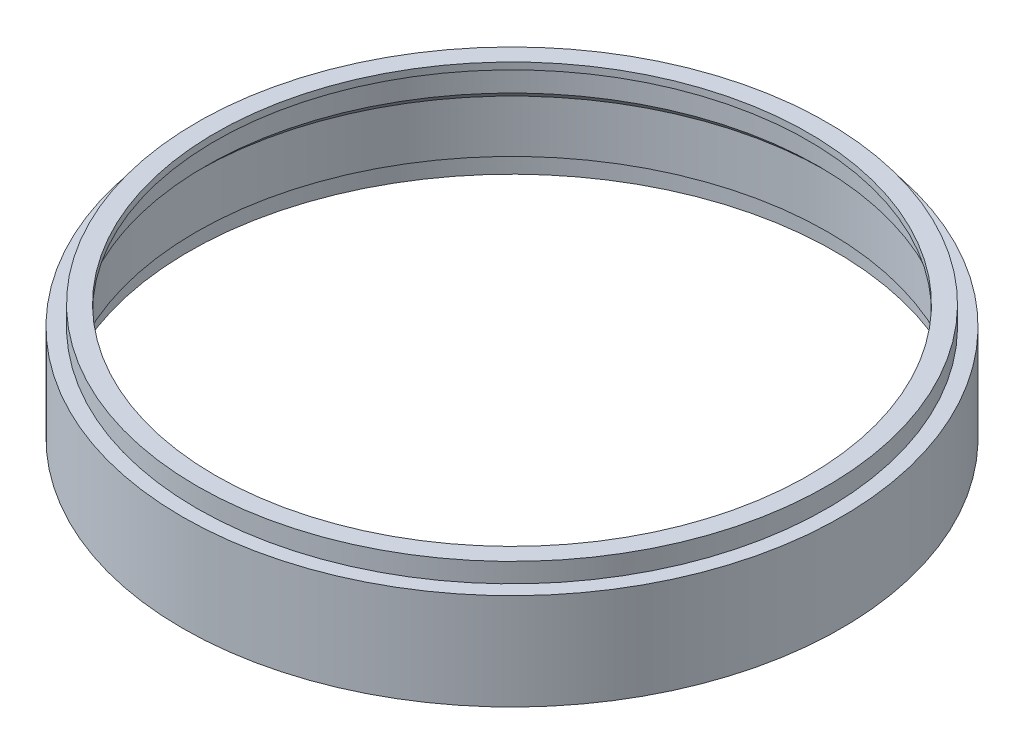
ISO-10303-21;
HEADER;
FILE_DESCRIPTION(('STEP AP214'),'2;1');
FILE_NAME('part.step','',(''),(''),'','','');
FILE_SCHEMA(('AUTOMOTIVE_DESIGN { 1 0 10303 214 1 1 1 1 }'));
ENDSEC;
DATA;
#1=APPLICATION_CONTEXT('core data for automotive mechanical design processes');
#2=APPLICATION_PROTOCOL_DEFINITION('international standard','automotive_design',2000,#1);
#3=PRODUCT_CONTEXT('',#1,'mechanical');
#4=PRODUCT('Part','Part','',(#3));
#5=PRODUCT_RELATED_PRODUCT_CATEGORY('part','',(#4));
#6=PRODUCT_DEFINITION_FORMATION('','',#4);
#7=PRODUCT_DEFINITION_CONTEXT('part definition',#1,'design');
#8=PRODUCT_DEFINITION('design','',#6,#7);
#9=PRODUCT_DEFINITION_SHAPE('','',#8);
#10=(LENGTH_UNIT() NAMED_UNIT(*) SI_UNIT(.MILLI.,.METRE.));
#11=(NAMED_UNIT(*) PLANE_ANGLE_UNIT() SI_UNIT($,.RADIAN.));
#12=(NAMED_UNIT(*) SI_UNIT($,.STERADIAN.) SOLID_ANGLE_UNIT());
#13=UNCERTAINTY_MEASURE_WITH_UNIT(LENGTH_MEASURE(1.E-05),#10,'distance_accuracy_value','');
#14=(GEOMETRIC_REPRESENTATION_CONTEXT(3) GLOBAL_UNCERTAINTY_ASSIGNED_CONTEXT((#13)) GLOBAL_UNIT_ASSIGNED_CONTEXT((#10,
#11,#12)) REPRESENTATION_CONTEXT('',''));
#15=CARTESIAN_POINT('',(0.,0.,0.));
#16=DIRECTION('',(0.,0.,1.));
#17=DIRECTION('',(1.,0.,0.));
#18=AXIS2_PLACEMENT_3D('',#15,#16,#17);
#19=CARTESIAN_POINT('',(-48.35,0.,0.));
#20=DIRECTION('',(0.,-1.,0.));
#21=DIRECTION('',(0.,0.,-1.));
#22=AXIS2_PLACEMENT_3D('',#19,#20,#21);
#23=PLANE('',#22);
#24=CARTESIAN_POINT('',(0.,0.,0.));
#25=DIRECTION('',(0.,1.,0.));
#26=DIRECTION('',(0.,0.,1.));
#27=AXIS2_PLACEMENT_3D('',#24,#25,#26);
#28=CIRCLE('',#27,47.4);
#29=CARTESIAN_POINT('',(0.,0.,47.4));
#30=VERTEX_POINT('',#29);
#31=EDGE_CURVE('E10',#30,#30,#28,.T.);
#32=ORIENTED_EDGE('',*,*,#31,.T.);
#33=EDGE_LOOP('',(#32));
#34=FACE_BOUND('',#33,.T.);
#35=CARTESIAN_POINT('',(0.,0.,0.));
#36=DIRECTION('',(0.,1.,0.));
#37=DIRECTION('',(0.,0.,1.));
#38=AXIS2_PLACEMENT_3D('',#35,#36,#37);
#39=CIRCLE('',#38,48.35);
#40=CARTESIAN_POINT('',(0.,0.,48.35));
#41=VERTEX_POINT('',#40);
#42=EDGE_CURVE('E75',#41,#41,#39,.T.);
#43=ORIENTED_EDGE('',*,*,#42,.F.);
#44=EDGE_LOOP('',(#43));
#45=FACE_BOUND('',#44,.T.);
#46=ADVANCED_FACE('F35',(#34,#45),#23,.T.);
#47=CARTESIAN_POINT('',(0.,0.,0.));
#48=DIRECTION('',(0.,1.,0.));
#49=DIRECTION('',(0.,0.,1.));
#50=AXIS2_PLACEMENT_3D('',#47,#48,#49);
#51=CYLINDRICAL_SURFACE('',#50,47.4);
#52=CARTESIAN_POINT('',(0.,3.,0.));
#53=DIRECTION('',(0.,1.,0.));
#54=DIRECTION('',(0.,0.,1.));
#55=AXIS2_PLACEMENT_3D('',#52,#53,#54);
#56=CIRCLE('',#55,47.4);
#57=CARTESIAN_POINT('',(0.,3.,47.4));
#58=VERTEX_POINT('',#57);
#59=EDGE_CURVE('E41',#58,#58,#56,.T.);
#60=ORIENTED_EDGE('',*,*,#59,.T.);
#61=EDGE_LOOP('',(#60));
#62=FACE_BOUND('',#61,.T.);
#63=ORIENTED_EDGE('',*,*,#31,.F.);
#64=EDGE_LOOP('',(#63));
#65=FACE_BOUND('',#64,.T.);
#66=ADVANCED_FACE('F83',(#62,#65),#51,.F.);
#67=CARTESIAN_POINT('',(-47.4,3.,0.));
#68=DIRECTION('',(0.,-1.,0.));
#69=DIRECTION('',(0.,0.,-1.));
#70=AXIS2_PLACEMENT_3D('',#67,#68,#69);
#71=PLANE('',#70);
#72=CARTESIAN_POINT('',(0.,3.,0.));
#73=DIRECTION('',(0.,1.,0.));
#74=DIRECTION('',(0.,0.,1.));
#75=AXIS2_PLACEMENT_3D('',#72,#73,#74);
#76=CIRCLE('',#75,46.35);
#77=CARTESIAN_POINT('',(0.,3.,46.35));
#78=VERTEX_POINT('',#77);
#79=EDGE_CURVE('E45',#78,#78,#76,.T.);
#80=ORIENTED_EDGE('',*,*,#79,.T.);
#81=EDGE_LOOP('',(#80));
#82=FACE_BOUND('',#81,.T.);
#83=ORIENTED_EDGE('',*,*,#59,.F.);
#84=EDGE_LOOP('',(#83));
#85=FACE_BOUND('',#84,.T.);
#86=ADVANCED_FACE('F87',(#82,#85),#71,.T.);
#87=CARTESIAN_POINT('',(0.,0.,0.));
#88=DIRECTION('',(0.,1.,0.));
#89=DIRECTION('',(0.,0.,1.));
#90=AXIS2_PLACEMENT_3D('',#87,#88,#89);
#91=CYLINDRICAL_SURFACE('',#90,46.35);
#92=CARTESIAN_POINT('',(0.,10.6699993692233,0.));
#93=DIRECTION('',(0.,1.,0.));
#94=DIRECTION('',(0.,0.,1.));
#95=AXIS2_PLACEMENT_3D('',#92,#93,#94);
#96=CIRCLE('',#95,46.35);
#97=CARTESIAN_POINT('',(0.,10.6699993692233,46.35));
#98=VERTEX_POINT('',#97);
#99=EDGE_CURVE('E49',#98,#98,#96,.T.);
#100=ORIENTED_EDGE('',*,*,#99,.T.);
#101=EDGE_LOOP('',(#100));
#102=FACE_BOUND('',#101,.T.);
#103=ORIENTED_EDGE('',*,*,#79,.F.);
#104=EDGE_LOOP('',(#103));
#105=FACE_BOUND('',#104,.T.);
#106=ADVANCED_FACE('F91',(#102,#105),#91,.F.);
#107=CARTESIAN_POINT('',(0.,10.6699993692233,0.));
#108=DIRECTION('',(0.,-1.,0.));
#109=DIRECTION('',(0.,0.,-1.));
#110=AXIS2_PLACEMENT_3D('',#107,#108,#109);
#111=CONICAL_SURFACE('',#110,46.35,0.78539816339745);
#112=CARTESIAN_POINT('',(0.,12.,0.));
#113=DIRECTION('',(0.,1.,0.));
#114=DIRECTION('',(0.,0.,1.));
#115=AXIS2_PLACEMENT_3D('',#112,#113,#114);
#116=CIRCLE('',#115,45.0199993692233);
#117=CARTESIAN_POINT('',(0.,12.,45.0199993692233));
#118=VERTEX_POINT('',#117);
#119=EDGE_CURVE('E54',#118,#118,#116,.T.);
#120=ORIENTED_EDGE('',*,*,#119,.T.);
#121=EDGE_LOOP('',(#120));
#122=FACE_BOUND('',#121,.T.);
#123=ORIENTED_EDGE('',*,*,#99,.F.);
#124=EDGE_LOOP('',(#123));
#125=FACE_BOUND('',#124,.T.);
#126=ADVANCED_FACE('F98',(#122,#125),#111,.F.);
#127=CARTESIAN_POINT('',(0.,0.,0.));
#128=DIRECTION('',(0.,1.,0.));
#129=DIRECTION('',(0.,0.,1.));
#130=AXIS2_PLACEMENT_3D('',#127,#128,#129);
#131=CYLINDRICAL_SURFACE('',#130,45.0199993692233);
#132=CARTESIAN_POINT('',(0.,16.,0.));
#133=DIRECTION('',(0.,1.,0.));
#134=DIRECTION('',(0.,0.,1.));
#135=AXIS2_PLACEMENT_3D('',#132,#133,#134);
#136=CIRCLE('',#135,45.0199993692233);
#137=CARTESIAN_POINT('',(0.,16.,45.0199993692233));
#138=VERTEX_POINT('',#137);
#139=EDGE_CURVE('E57',#138,#138,#136,.T.);
#140=ORIENTED_EDGE('',*,*,#139,.T.);
#141=EDGE_LOOP('',(#140));
#142=FACE_BOUND('',#141,.T.);
#143=ORIENTED_EDGE('',*,*,#119,.F.);
#144=EDGE_LOOP('',(#143));
#145=FACE_BOUND('',#144,.T.);
#146=ADVANCED_FACE('F102',(#142,#145),#131,.F.);
#147=CARTESIAN_POINT('',(-45.0199993692233,16.,0.));
#148=DIRECTION('',(0.,-1.,0.));
#149=DIRECTION('',(0.,0.,-1.));
#150=AXIS2_PLACEMENT_3D('',#147,#148,#149);
#151=PLANE('',#150);
#152=CARTESIAN_POINT('',(0.,16.,0.));
#153=DIRECTION('',(0.,1.,0.));
#154=DIRECTION('',(0.,0.,1.));
#155=AXIS2_PLACEMENT_3D('',#152,#153,#154);
#156=CIRCLE('',#155,43.5199993692233);
#157=CARTESIAN_POINT('',(0.,16.,43.5199993692233));
#158=VERTEX_POINT('',#157);
#159=EDGE_CURVE('E60',#158,#158,#156,.T.);
#160=ORIENTED_EDGE('',*,*,#159,.T.);
#161=EDGE_LOOP('',(#160));
#162=FACE_BOUND('',#161,.T.);
#163=ORIENTED_EDGE('',*,*,#139,.F.);
#164=EDGE_LOOP('',(#163));
#165=FACE_BOUND('',#164,.T.);
#166=ADVANCED_FACE('F106',(#162,#165),#151,.T.);
#167=CARTESIAN_POINT('',(0.,0.,0.));
#168=DIRECTION('',(0.,1.,0.));
#169=DIRECTION('',(0.,0.,1.));
#170=AXIS2_PLACEMENT_3D('',#167,#168,#169);
#171=CYLINDRICAL_SURFACE('',#170,43.5199993692233);
#172=CARTESIAN_POINT('',(0.,17.,0.));
#173=DIRECTION('',(0.,1.,0.));
#174=DIRECTION('',(0.,0.,1.));
#175=AXIS2_PLACEMENT_3D('',#172,#173,#174);
#176=CIRCLE('',#175,43.5199993692233);
#177=CARTESIAN_POINT('',(0.,17.,43.5199993692233));
#178=VERTEX_POINT('',#177);
#179=EDGE_CURVE('E63',#178,#178,#176,.T.);
#180=ORIENTED_EDGE('',*,*,#179,.T.);
#181=EDGE_LOOP('',(#180));
#182=FACE_BOUND('',#181,.T.);
#183=ORIENTED_EDGE('',*,*,#159,.F.);
#184=EDGE_LOOP('',(#183));
#185=FACE_BOUND('',#184,.T.);
#186=ADVANCED_FACE('F110',(#182,#185),#171,.F.);
#187=CARTESIAN_POINT('',(-46.2199993692233,17.,0.));
#188=DIRECTION('',(0.,1.,0.));
#189=DIRECTION('',(0.,0.,1.));
#190=AXIS2_PLACEMENT_3D('',#187,#188,#189);
#191=PLANE('',#190);
#192=CARTESIAN_POINT('',(0.,17.,0.));
#193=DIRECTION('',(0.,1.,0.));
#194=DIRECTION('',(0.,0.,1.));
#195=AXIS2_PLACEMENT_3D('',#192,#193,#194);
#196=CIRCLE('',#195,46.2199993692233);
#197=CARTESIAN_POINT('',(0.,17.,46.2199993692233));
#198=VERTEX_POINT('',#197);
#199=EDGE_CURVE('E66',#198,#198,#196,.T.);
#200=ORIENTED_EDGE('',*,*,#199,.T.);
#201=EDGE_LOOP('',(#200));
#202=FACE_BOUND('',#201,.T.);
#203=ORIENTED_EDGE('',*,*,#179,.F.);
#204=EDGE_LOOP('',(#203));
#205=FACE_BOUND('',#204,.T.);
#206=ADVANCED_FACE('F114',(#202,#205),#191,.T.);
#207=CARTESIAN_POINT('',(0.,0.,0.));
#208=DIRECTION('',(0.,1.,0.));
#209=DIRECTION('',(0.,0.,1.));
#210=AXIS2_PLACEMENT_3D('',#207,#208,#209);
#211=CYLINDRICAL_SURFACE('',#210,46.2199993692233);
#212=CARTESIAN_POINT('',(0.,14.15,0.));
#213=DIRECTION('',(0.,1.,0.));
#214=DIRECTION('',(0.,0.,1.));
#215=AXIS2_PLACEMENT_3D('',#212,#213,#214);
#216=CIRCLE('',#215,46.2199993692233);
#217=CARTESIAN_POINT('',(0.,14.15,46.2199993692233));
#218=VERTEX_POINT('',#217);
#219=EDGE_CURVE('E69',#218,#218,#216,.T.);
#220=ORIENTED_EDGE('',*,*,#219,.T.);
#221=EDGE_LOOP('',(#220));
#222=FACE_BOUND('',#221,.T.);
#223=ORIENTED_EDGE('',*,*,#199,.F.);
#224=EDGE_LOOP('',(#223));
#225=FACE_BOUND('',#224,.T.);
#226=ADVANCED_FACE('F118',(#222,#225),#211,.T.);
#227=CARTESIAN_POINT('',(-46.2199993692233,14.15,0.));
#228=DIRECTION('',(0.,1.,0.));
#229=DIRECTION('',(0.,0.,1.));
#230=AXIS2_PLACEMENT_3D('',#227,#228,#229);
#231=PLANE('',#230);
#232=CARTESIAN_POINT('',(0.,14.15,0.));
#233=DIRECTION('',(0.,1.,0.));
#234=DIRECTION('',(0.,0.,1.));
#235=AXIS2_PLACEMENT_3D('',#232,#233,#234);
#236=CIRCLE('',#235,48.35);
#237=CARTESIAN_POINT('',(0.,14.15,48.35));
#238=VERTEX_POINT('',#237);
#239=EDGE_CURVE('E72',#238,#238,#236,.T.);
#240=ORIENTED_EDGE('',*,*,#239,.T.);
#241=EDGE_LOOP('',(#240));
#242=FACE_BOUND('',#241,.T.);
#243=ORIENTED_EDGE('',*,*,#219,.F.);
#244=EDGE_LOOP('',(#243));
#245=FACE_BOUND('',#244,.T.);
#246=ADVANCED_FACE('F122',(#242,#245),#231,.T.);
#247=CARTESIAN_POINT('',(0.,0.,0.));
#248=DIRECTION('',(0.,1.,0.));
#249=DIRECTION('',(0.,0.,1.));
#250=AXIS2_PLACEMENT_3D('',#247,#248,#249);
#251=CYLINDRICAL_SURFACE('',#250,48.35);
#252=ORIENTED_EDGE('',*,*,#42,.T.);
#253=EDGE_LOOP('',(#252));
#254=FACE_BOUND('',#253,.T.);
#255=ORIENTED_EDGE('',*,*,#239,.F.);
#256=EDGE_LOOP('',(#255));
#257=FACE_BOUND('',#256,.T.);
#258=ADVANCED_FACE('F79',(#254,#257),#251,.T.);
#259=CLOSED_SHELL('',(#46,#66,#86,#106,#126,#146,#166,#186,#206,#226,#246,#258));
#260=MANIFOLD_SOLID_BREP('B2',#259);
#261=ADVANCED_BREP_SHAPE_REPRESENTATION('',(#18,#260),#14);
#262=SHAPE_DEFINITION_REPRESENTATION(#9,#261);
ENDSEC;
END-ISO-10303-21;
